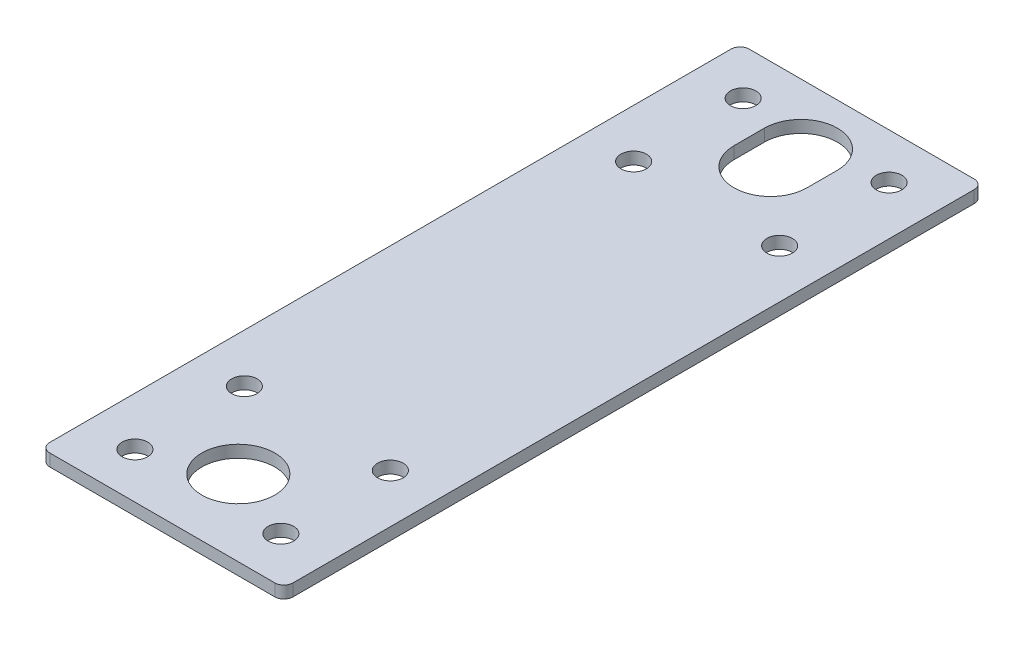
ISO-10303-21;
HEADER;
FILE_DESCRIPTION(('STEP AP214'),'2;1');
FILE_NAME('part.step','',(''),(''),'','','');
FILE_SCHEMA(('AUTOMOTIVE_DESIGN { 1 0 10303 214 1 1 1 1 }'));
ENDSEC;
DATA;
#1=APPLICATION_CONTEXT('core data for automotive mechanical design processes');
#2=APPLICATION_PROTOCOL_DEFINITION('international standard','automotive_design',2000,#1);
#3=PRODUCT_CONTEXT('',#1,'mechanical');
#4=PRODUCT('Part','Part','',(#3));
#5=PRODUCT_RELATED_PRODUCT_CATEGORY('part','',(#4));
#6=PRODUCT_DEFINITION_FORMATION('','',#4);
#7=PRODUCT_DEFINITION_CONTEXT('part definition',#1,'design');
#8=PRODUCT_DEFINITION('design','',#6,#7);
#9=PRODUCT_DEFINITION_SHAPE('','',#8);
#10=(LENGTH_UNIT() NAMED_UNIT(*) SI_UNIT(.MILLI.,.METRE.));
#11=(NAMED_UNIT(*) PLANE_ANGLE_UNIT() SI_UNIT($,.RADIAN.));
#12=(NAMED_UNIT(*) SI_UNIT($,.STERADIAN.) SOLID_ANGLE_UNIT());
#13=UNCERTAINTY_MEASURE_WITH_UNIT(LENGTH_MEASURE(1.E-05),#10,'distance_accuracy_value','');
#14=(GEOMETRIC_REPRESENTATION_CONTEXT(3) GLOBAL_UNCERTAINTY_ASSIGNED_CONTEXT((#13)) GLOBAL_UNIT_ASSIGNED_CONTEXT((#10,
#11,#12)) REPRESENTATION_CONTEXT('',''));
#15=CARTESIAN_POINT('',(0.,0.,0.));
#16=DIRECTION('',(0.,0.,1.));
#17=DIRECTION('',(1.,0.,0.));
#18=AXIS2_PLACEMENT_3D('',#15,#16,#17);
#19=CARTESIAN_POINT('',(-20.,2.,0.));
#20=DIRECTION('',(1.,0.,0.));
#21=DIRECTION('',(0.,0.,-1.));
#22=AXIS2_PLACEMENT_3D('',#19,#20,#21);
#23=PLANE('',#22);
#24=DIRECTION('',(0.,0.,1.));
#25=VECTOR('',#24,1.);
#26=CARTESIAN_POINT('',(-20.,2.,0.));
#27=LINE('',#26,#25);
#28=CARTESIAN_POINT('',(-20.,2.,-56.));
#29=VERTEX_POINT('',#28);
#30=CARTESIAN_POINT('',(-20.,2.,56.));
#31=VERTEX_POINT('',#30);
#32=EDGE_CURVE('E218',#29,#31,#27,.T.);
#33=ORIENTED_EDGE('',*,*,#32,.T.);
#34=DIRECTION('',(0.,-1.,0.));
#35=VECTOR('',#34,1.);
#36=CARTESIAN_POINT('',(-20.,0.,56.));
#37=LINE('',#36,#35);
#38=CARTESIAN_POINT('',(-20.,0.,56.));
#39=VERTEX_POINT('',#38);
#40=EDGE_CURVE('E248',#31,#39,#37,.T.);
#41=ORIENTED_EDGE('',*,*,#40,.T.);
#42=DIRECTION('',(0.,0.,1.));
#43=VECTOR('',#42,1.);
#44=CARTESIAN_POINT('',(-20.,0.,0.));
#45=LINE('',#44,#43);
#46=CARTESIAN_POINT('',(-20.,0.,-56.));
#47=VERTEX_POINT('',#46);
#48=EDGE_CURVE('E215',#47,#39,#45,.T.);
#49=ORIENTED_EDGE('',*,*,#48,.F.);
#50=DIRECTION('',(0.,-1.,0.));
#51=VECTOR('',#50,1.);
#52=CARTESIAN_POINT('',(-20.,2.,-56.));
#53=LINE('',#52,#51);
#54=EDGE_CURVE('E246',#47,#29,#53,.F.);
#55=ORIENTED_EDGE('',*,*,#54,.T.);
#56=EDGE_LOOP('',(#33,#41,#49,#55));
#57=FACE_BOUND('',#56,.T.);
#58=ADVANCED_FACE('F35',(#57),#23,.T.);
#59=CARTESIAN_POINT('',(0.,2.,-57.5));
#60=DIRECTION('',(0.,0.,-1.));
#61=DIRECTION('',(-1.,0.,0.));
#62=AXIS2_PLACEMENT_3D('',#59,#60,#61);
#63=PLANE('',#62);
#64=DIRECTION('',(1.,0.,0.));
#65=VECTOR('',#64,1.);
#66=CARTESIAN_POINT('',(0.,2.,-57.5));
#67=LINE('',#66,#65);
#68=CARTESIAN_POINT('',(-58.5,2.,-57.5));
#69=VERTEX_POINT('',#68);
#70=CARTESIAN_POINT('',(-21.5,2.,-57.5));
#71=VERTEX_POINT('',#70);
#72=EDGE_CURVE('E221',#69,#71,#67,.T.);
#73=ORIENTED_EDGE('',*,*,#72,.T.);
#74=DIRECTION('',(0.,-1.,0.));
#75=VECTOR('',#74,1.);
#76=CARTESIAN_POINT('',(-21.5,2.,-57.5));
#77=LINE('',#76,#75);
#78=CARTESIAN_POINT('',(-21.5,0.,-57.5));
#79=VERTEX_POINT('',#78);
#80=EDGE_CURVE('E11',#71,#79,#77,.T.);
#81=ORIENTED_EDGE('',*,*,#80,.T.);
#82=DIRECTION('',(1.,0.,0.));
#83=VECTOR('',#82,1.);
#84=CARTESIAN_POINT('',(0.,0.,-57.5));
#85=LINE('',#84,#83);
#86=CARTESIAN_POINT('',(-58.5,0.,-57.5));
#87=VERTEX_POINT('',#86);
#88=EDGE_CURVE('E234',#87,#79,#85,.T.);
#89=ORIENTED_EDGE('',*,*,#88,.F.);
#90=DIRECTION('',(0.,-1.,0.));
#91=VECTOR('',#90,1.);
#92=CARTESIAN_POINT('',(-58.5,2.,-57.5));
#93=LINE('',#92,#91);
#94=EDGE_CURVE('E43',#87,#69,#93,.F.);
#95=ORIENTED_EDGE('',*,*,#94,.T.);
#96=EDGE_LOOP('',(#73,#81,#89,#95));
#97=FACE_BOUND('',#96,.T.);
#98=ADVANCED_FACE('F277',(#97),#63,.T.);
#99=CARTESIAN_POINT('',(-60.,2.,0.));
#100=DIRECTION('',(-1.,0.,0.));
#101=DIRECTION('',(0.,0.,1.));
#102=AXIS2_PLACEMENT_3D('',#99,#100,#101);
#103=PLANE('',#102);
#104=DIRECTION('',(0.,0.,-1.));
#105=VECTOR('',#104,1.);
#106=CARTESIAN_POINT('',(-60.,0.,0.));
#107=LINE('',#106,#105);
#108=CARTESIAN_POINT('',(-60.,0.,56.));
#109=VERTEX_POINT('',#108);
#110=CARTESIAN_POINT('',(-60.,0.,-56.));
#111=VERTEX_POINT('',#110);
#112=EDGE_CURVE('E237',#109,#111,#107,.T.);
#113=ORIENTED_EDGE('',*,*,#112,.F.);
#114=DIRECTION('',(0.,-1.,0.));
#115=VECTOR('',#114,1.);
#116=CARTESIAN_POINT('',(-60.,2.,56.));
#117=LINE('',#116,#115);
#118=CARTESIAN_POINT('',(-60.,2.,56.));
#119=VERTEX_POINT('',#118);
#120=EDGE_CURVE('E57',#109,#119,#117,.F.);
#121=ORIENTED_EDGE('',*,*,#120,.T.);
#122=DIRECTION('',(0.,0.,-1.));
#123=VECTOR('',#122,1.);
#124=CARTESIAN_POINT('',(-60.,2.,0.));
#125=LINE('',#124,#123);
#126=CARTESIAN_POINT('',(-60.,2.,-56.));
#127=VERTEX_POINT('',#126);
#128=EDGE_CURVE('E225',#119,#127,#125,.T.);
#129=ORIENTED_EDGE('',*,*,#128,.T.);
#130=DIRECTION('',(0.,-1.,0.));
#131=VECTOR('',#130,1.);
#132=CARTESIAN_POINT('',(-60.,2.,-56.));
#133=LINE('',#132,#131);
#134=EDGE_CURVE('E271',#127,#111,#133,.T.);
#135=ORIENTED_EDGE('',*,*,#134,.T.);
#136=EDGE_LOOP('',(#113,#121,#129,#135));
#137=FACE_BOUND('',#136,.T.);
#138=ADVANCED_FACE('F285',(#137),#103,.T.);
#139=CARTESIAN_POINT('',(0.,2.,57.5));
#140=DIRECTION('',(0.,0.,-1.));
#141=DIRECTION('',(-1.,0.,0.));
#142=AXIS2_PLACEMENT_3D('',#139,#140,#141);
#143=PLANE('',#142);
#144=DIRECTION('',(1.,0.,0.));
#145=VECTOR('',#144,1.);
#146=CARTESIAN_POINT('',(0.,0.,57.5));
#147=LINE('',#146,#145);
#148=CARTESIAN_POINT('',(-58.5,0.,57.5));
#149=VERTEX_POINT('',#148);
#150=CARTESIAN_POINT('',(-21.5,0.,57.5));
#151=VERTEX_POINT('',#150);
#152=EDGE_CURVE('E240',#149,#151,#147,.T.);
#153=ORIENTED_EDGE('',*,*,#152,.T.);
#154=DIRECTION('',(0.,-1.,0.));
#155=VECTOR('',#154,1.);
#156=CARTESIAN_POINT('',(-21.5,2.,57.5));
#157=LINE('',#156,#155);
#158=CARTESIAN_POINT('',(-21.5,2.,57.5));
#159=VERTEX_POINT('',#158);
#160=EDGE_CURVE('E262',#151,#159,#157,.F.);
#161=ORIENTED_EDGE('',*,*,#160,.T.);
#162=DIRECTION('',(1.,0.,0.));
#163=VECTOR('',#162,1.);
#164=CARTESIAN_POINT('',(0.,2.,57.5));
#165=LINE('',#164,#163);
#166=CARTESIAN_POINT('',(-58.5,2.,57.5));
#167=VERTEX_POINT('',#166);
#168=EDGE_CURVE('E227',#167,#159,#165,.T.);
#169=ORIENTED_EDGE('',*,*,#168,.F.);
#170=DIRECTION('',(0.,-1.,0.));
#171=VECTOR('',#170,1.);
#172=CARTESIAN_POINT('',(-58.5,0.,57.5));
#173=LINE('',#172,#171);
#174=EDGE_CURVE('E259',#167,#149,#173,.T.);
#175=ORIENTED_EDGE('',*,*,#174,.T.);
#176=EDGE_LOOP('',(#153,#161,#169,#175));
#177=FACE_BOUND('',#176,.T.);
#178=ADVANCED_FACE('F294',(#177),#143,.F.);
#179=CARTESIAN_POINT('',(-40.,2.,45.));
#180=DIRECTION('',(0.,-1.,0.));
#181=DIRECTION('',(0.,0.,-1.));
#182=AXIS2_PLACEMENT_3D('',#179,#180,#181);
#183=CYLINDRICAL_SURFACE('',#182,5.99999999999999);
#184=CARTESIAN_POINT('',(-40.,2.,45.));
#185=DIRECTION('',(0.,1.,0.));
#186=DIRECTION('',(0.,0.,1.));
#187=AXIS2_PLACEMENT_3D('',#184,#185,#186);
#188=CIRCLE('',#187,5.99999999999999);
#189=CARTESIAN_POINT('',(-40.,2.,51.));
#190=VERTEX_POINT('',#189);
#191=EDGE_CURVE('E137',#190,#190,#188,.F.);
#192=ORIENTED_EDGE('',*,*,#191,.F.);
#193=EDGE_LOOP('',(#192));
#194=FACE_BOUND('',#193,.T.);
#195=CARTESIAN_POINT('',(-40.,0.,45.));
#196=DIRECTION('',(0.,1.,0.));
#197=DIRECTION('',(0.,0.,1.));
#198=AXIS2_PLACEMENT_3D('',#195,#196,#197);
#199=CIRCLE('',#198,5.99999999999999);
#200=CARTESIAN_POINT('',(-40.,0.,51.));
#201=VERTEX_POINT('',#200);
#202=EDGE_CURVE('E222',#201,#201,#199,.F.);
#203=ORIENTED_EDGE('',*,*,#202,.T.);
#204=EDGE_LOOP('',(#203));
#205=FACE_BOUND('',#204,.T.);
#206=ADVANCED_FACE('F369',(#194,#205),#183,.F.);
#207=CARTESIAN_POINT('',(0.,2.,0.));
#208=DIRECTION('',(0.,1.,0.));
#209=DIRECTION('',(0.,0.,1.));
#210=AXIS2_PLACEMENT_3D('',#207,#208,#209);
#211=PLANE('',#210);
#212=DIRECTION('',(0.,0.,-1.));
#213=VECTOR('',#212,1.);
#214=CARTESIAN_POINT('',(-34.,2.,-47.5));
#215=LINE('',#214,#213);
#216=CARTESIAN_POINT('',(-34.,2.,-42.5));
#217=VERTEX_POINT('',#216);
#218=CARTESIAN_POINT('',(-34.,2.,-47.5));
#219=VERTEX_POINT('',#218);
#220=EDGE_CURVE('E152',#217,#219,#215,.T.);
#221=ORIENTED_EDGE('',*,*,#220,.F.);
#222=CARTESIAN_POINT('',(-40.,2.,-42.5));
#223=DIRECTION('',(0.,1.,0.));
#224=DIRECTION('',(0.,0.,1.));
#225=AXIS2_PLACEMENT_3D('',#222,#223,#224);
#226=CIRCLE('',#225,6.);
#227=CARTESIAN_POINT('',(-46.,2.,-42.5));
#228=VERTEX_POINT('',#227);
#229=EDGE_CURVE('E155',#228,#217,#226,.T.);
#230=ORIENTED_EDGE('',*,*,#229,.F.);
#231=DIRECTION('',(0.,0.,1.));
#232=VECTOR('',#231,1.);
#233=CARTESIAN_POINT('',(-46.,2.,-47.5));
#234=LINE('',#233,#232);
#235=CARTESIAN_POINT('',(-46.,2.,-47.5));
#236=VERTEX_POINT('',#235);
#237=EDGE_CURVE('E159',#236,#228,#234,.T.);
#238=ORIENTED_EDGE('',*,*,#237,.F.);
#239=CARTESIAN_POINT('',(-40.,2.,-47.5));
#240=DIRECTION('',(0.,1.,0.));
#241=DIRECTION('',(0.,0.,1.));
#242=AXIS2_PLACEMENT_3D('',#239,#240,#241);
#243=CIRCLE('',#242,6.);
#244=EDGE_CURVE('E146',#219,#236,#243,.T.);
#245=ORIENTED_EDGE('',*,*,#244,.F.);
#246=EDGE_LOOP('',(#221,#230,#238,#245));
#247=FACE_BOUND('',#246,.T.);
#248=CARTESIAN_POINT('',(-28.,2.,32.));
#249=DIRECTION('',(0.,1.,0.));
#250=DIRECTION('',(0.,0.,-1.));
#251=AXIS2_PLACEMENT_3D('',#248,#249,#250);
#252=CIRCLE('',#251,2.1);
#253=CARTESIAN_POINT('',(-28.,2.,29.9));
#254=VERTEX_POINT('',#253);
#255=EDGE_CURVE('E174',#254,#254,#252,.T.);
#256=ORIENTED_EDGE('',*,*,#255,.F.);
#257=EDGE_LOOP('',(#256));
#258=FACE_BOUND('',#257,.T.);
#259=CARTESIAN_POINT('',(-28.,2.,50.));
#260=DIRECTION('',(0.,1.,0.));
#261=DIRECTION('',(0.,0.,1.));
#262=AXIS2_PLACEMENT_3D('',#259,#260,#261);
#263=CIRCLE('',#262,2.1);
#264=CARTESIAN_POINT('',(-28.,2.,52.1));
#265=VERTEX_POINT('',#264);
#266=EDGE_CURVE('E180',#265,#265,#263,.T.);
#267=ORIENTED_EDGE('',*,*,#266,.F.);
#268=EDGE_LOOP('',(#267));
#269=FACE_BOUND('',#268,.T.);
#270=CARTESIAN_POINT('',(-52.,2.,50.));
#271=DIRECTION('',(0.,1.,0.));
#272=DIRECTION('',(0.,0.,-1.));
#273=AXIS2_PLACEMENT_3D('',#270,#271,#272);
#274=CIRCLE('',#273,2.1);
#275=CARTESIAN_POINT('',(-52.,2.,47.9));
#276=VERTEX_POINT('',#275);
#277=EDGE_CURVE('E186',#276,#276,#274,.T.);
#278=ORIENTED_EDGE('',*,*,#277,.F.);
#279=EDGE_LOOP('',(#278));
#280=FACE_BOUND('',#279,.T.);
#281=CARTESIAN_POINT('',(-28.,2.,-50.));
#282=DIRECTION('',(0.,1.,0.));
#283=DIRECTION('',(0.,0.,-1.));
#284=AXIS2_PLACEMENT_3D('',#281,#282,#283);
#285=CIRCLE('',#284,2.1);
#286=CARTESIAN_POINT('',(-28.,2.,-52.1));
#287=VERTEX_POINT('',#286);
#288=EDGE_CURVE('E192',#287,#287,#285,.T.);
#289=ORIENTED_EDGE('',*,*,#288,.F.);
#290=EDGE_LOOP('',(#289));
#291=FACE_BOUND('',#290,.T.);
#292=CARTESIAN_POINT('',(-52.,2.,-50.));
#293=DIRECTION('',(0.,1.,0.));
#294=DIRECTION('',(0.,0.,1.));
#295=AXIS2_PLACEMENT_3D('',#292,#293,#294);
#296=CIRCLE('',#295,2.1);
#297=CARTESIAN_POINT('',(-52.,2.,-47.9));
#298=VERTEX_POINT('',#297);
#299=EDGE_CURVE('E198',#298,#298,#296,.T.);
#300=ORIENTED_EDGE('',*,*,#299,.F.);
#301=EDGE_LOOP('',(#300));
#302=FACE_BOUND('',#301,.T.);
#303=CARTESIAN_POINT('',(-52.,2.,-32.));
#304=DIRECTION('',(0.,1.,0.));
#305=DIRECTION('',(0.,0.,-1.));
#306=AXIS2_PLACEMENT_3D('',#303,#304,#305);
#307=CIRCLE('',#306,2.1);
#308=CARTESIAN_POINT('',(-52.,2.,-34.1));
#309=VERTEX_POINT('',#308);
#310=EDGE_CURVE('E204',#309,#309,#307,.T.);
#311=ORIENTED_EDGE('',*,*,#310,.F.);
#312=EDGE_LOOP('',(#311));
#313=FACE_BOUND('',#312,.T.);
#314=CARTESIAN_POINT('',(-28.,2.,-32.));
#315=DIRECTION('',(0.,1.,0.));
#316=DIRECTION('',(0.,0.,1.));
#317=AXIS2_PLACEMENT_3D('',#314,#315,#316);
#318=CIRCLE('',#317,2.1);
#319=CARTESIAN_POINT('',(-28.,2.,-29.9));
#320=VERTEX_POINT('',#319);
#321=EDGE_CURVE('E165',#320,#320,#318,.T.);
#322=ORIENTED_EDGE('',*,*,#321,.F.);
#323=EDGE_LOOP('',(#322));
#324=FACE_BOUND('',#323,.T.);
#325=CARTESIAN_POINT('',(-52.,2.,32.));
#326=DIRECTION('',(0.,1.,0.));
#327=DIRECTION('',(0.,0.,1.));
#328=AXIS2_PLACEMENT_3D('',#325,#326,#327);
#329=CIRCLE('',#328,2.1);
#330=CARTESIAN_POINT('',(-52.,2.,34.1));
#331=VERTEX_POINT('',#330);
#332=EDGE_CURVE('E173',#331,#331,#329,.T.);
#333=ORIENTED_EDGE('',*,*,#332,.F.);
#334=EDGE_LOOP('',(#333));
#335=FACE_BOUND('',#334,.T.);
#336=ORIENTED_EDGE('',*,*,#168,.T.);
#337=CARTESIAN_POINT('',(-21.5,2.,56.));
#338=DIRECTION('',(0.,1.,0.));
#339=DIRECTION('',(0.,0.,1.));
#340=AXIS2_PLACEMENT_3D('',#337,#338,#339);
#341=CIRCLE('',#340,1.5);
#342=EDGE_CURVE('E269',#159,#31,#341,.T.);
#343=ORIENTED_EDGE('',*,*,#342,.T.);
#344=ORIENTED_EDGE('',*,*,#32,.F.);
#345=CARTESIAN_POINT('',(-21.5,2.,-56.));
#346=DIRECTION('',(0.,1.,0.));
#347=DIRECTION('',(0.,0.,1.));
#348=AXIS2_PLACEMENT_3D('',#345,#346,#347);
#349=CIRCLE('',#348,1.5);
#350=EDGE_CURVE('E265',#29,#71,#349,.T.);
#351=ORIENTED_EDGE('',*,*,#350,.T.);
#352=ORIENTED_EDGE('',*,*,#72,.F.);
#353=CARTESIAN_POINT('',(-58.5,2.,-56.));
#354=DIRECTION('',(0.,1.,0.));
#355=DIRECTION('',(0.,0.,1.));
#356=AXIS2_PLACEMENT_3D('',#353,#354,#355);
#357=CIRCLE('',#356,1.5);
#358=EDGE_CURVE('E50',#69,#127,#357,.T.);
#359=ORIENTED_EDGE('',*,*,#358,.T.);
#360=ORIENTED_EDGE('',*,*,#128,.F.);
#361=CARTESIAN_POINT('',(-58.5,2.,56.));
#362=DIRECTION('',(0.,1.,0.));
#363=DIRECTION('',(0.,0.,1.));
#364=AXIS2_PLACEMENT_3D('',#361,#362,#363);
#365=CIRCLE('',#364,1.5);
#366=EDGE_CURVE('E267',#119,#167,#365,.T.);
#367=ORIENTED_EDGE('',*,*,#366,.T.);
#368=EDGE_LOOP('',(#336,#343,#344,#351,#352,#359,#360,#367));
#369=FACE_BOUND('',#368,.T.);
#370=ORIENTED_EDGE('',*,*,#191,.T.);
#371=EDGE_LOOP('',(#370));
#372=FACE_BOUND('',#371,.T.);
#373=ADVANCED_FACE('F280',(#247,#258,#269,#280,#291,#302,#313,#324,#335,#369,#372),#211,.T.);
#374=CARTESIAN_POINT('',(0.,0.,0.));
#375=DIRECTION('',(0.,1.,0.));
#376=DIRECTION('',(0.,0.,1.));
#377=AXIS2_PLACEMENT_3D('',#374,#375,#376);
#378=PLANE('',#377);
#379=CARTESIAN_POINT('',(-28.,0.,32.));
#380=DIRECTION('',(0.,1.,0.));
#381=DIRECTION('',(0.,0.,-1.));
#382=AXIS2_PLACEMENT_3D('',#379,#380,#381);
#383=CIRCLE('',#382,2.1);
#384=CARTESIAN_POINT('',(-28.,0.,29.9));
#385=VERTEX_POINT('',#384);
#386=EDGE_CURVE('E170',#385,#385,#383,.T.);
#387=ORIENTED_EDGE('',*,*,#386,.T.);
#388=EDGE_LOOP('',(#387));
#389=FACE_BOUND('',#388,.T.);
#390=CARTESIAN_POINT('',(-28.,0.,50.));
#391=DIRECTION('',(0.,1.,0.));
#392=DIRECTION('',(0.,0.,1.));
#393=AXIS2_PLACEMENT_3D('',#390,#391,#392);
#394=CIRCLE('',#393,2.1);
#395=CARTESIAN_POINT('',(-28.,0.,52.1));
#396=VERTEX_POINT('',#395);
#397=EDGE_CURVE('E177',#396,#396,#394,.T.);
#398=ORIENTED_EDGE('',*,*,#397,.T.);
#399=EDGE_LOOP('',(#398));
#400=FACE_BOUND('',#399,.T.);
#401=CARTESIAN_POINT('',(-52.,0.,50.));
#402=DIRECTION('',(0.,1.,0.));
#403=DIRECTION('',(0.,0.,-1.));
#404=AXIS2_PLACEMENT_3D('',#401,#402,#403);
#405=CIRCLE('',#404,2.1);
#406=CARTESIAN_POINT('',(-52.,0.,47.9));
#407=VERTEX_POINT('',#406);
#408=EDGE_CURVE('E183',#407,#407,#405,.T.);
#409=ORIENTED_EDGE('',*,*,#408,.T.);
#410=EDGE_LOOP('',(#409));
#411=FACE_BOUND('',#410,.T.);
#412=CARTESIAN_POINT('',(-28.,0.,-50.));
#413=DIRECTION('',(0.,1.,0.));
#414=DIRECTION('',(0.,0.,-1.));
#415=AXIS2_PLACEMENT_3D('',#412,#413,#414);
#416=CIRCLE('',#415,2.1);
#417=CARTESIAN_POINT('',(-28.,0.,-52.1));
#418=VERTEX_POINT('',#417);
#419=EDGE_CURVE('E189',#418,#418,#416,.T.);
#420=ORIENTED_EDGE('',*,*,#419,.T.);
#421=EDGE_LOOP('',(#420));
#422=FACE_BOUND('',#421,.T.);
#423=CARTESIAN_POINT('',(-52.,0.,-50.));
#424=DIRECTION('',(0.,1.,0.));
#425=DIRECTION('',(0.,0.,1.));
#426=AXIS2_PLACEMENT_3D('',#423,#424,#425);
#427=CIRCLE('',#426,2.1);
#428=CARTESIAN_POINT('',(-52.,0.,-47.9));
#429=VERTEX_POINT('',#428);
#430=EDGE_CURVE('E195',#429,#429,#427,.T.);
#431=ORIENTED_EDGE('',*,*,#430,.T.);
#432=EDGE_LOOP('',(#431));
#433=FACE_BOUND('',#432,.T.);
#434=CARTESIAN_POINT('',(-52.,0.,-32.));
#435=DIRECTION('',(0.,1.,0.));
#436=DIRECTION('',(0.,0.,-1.));
#437=AXIS2_PLACEMENT_3D('',#434,#435,#436);
#438=CIRCLE('',#437,2.1);
#439=CARTESIAN_POINT('',(-52.,0.,-34.1));
#440=VERTEX_POINT('',#439);
#441=EDGE_CURVE('E201',#440,#440,#438,.T.);
#442=ORIENTED_EDGE('',*,*,#441,.T.);
#443=EDGE_LOOP('',(#442));
#444=FACE_BOUND('',#443,.T.);
#445=CARTESIAN_POINT('',(-28.,0.,-32.));
#446=DIRECTION('',(0.,1.,0.));
#447=DIRECTION('',(0.,0.,1.));
#448=AXIS2_PLACEMENT_3D('',#445,#446,#447);
#449=CIRCLE('',#448,2.1);
#450=CARTESIAN_POINT('',(-28.,0.,-29.9));
#451=VERTEX_POINT('',#450);
#452=EDGE_CURVE('E207',#451,#451,#449,.T.);
#453=ORIENTED_EDGE('',*,*,#452,.T.);
#454=EDGE_LOOP('',(#453));
#455=FACE_BOUND('',#454,.T.);
#456=CARTESIAN_POINT('',(-52.,0.,32.));
#457=DIRECTION('',(0.,1.,0.));
#458=DIRECTION('',(0.,0.,1.));
#459=AXIS2_PLACEMENT_3D('',#456,#457,#458);
#460=CIRCLE('',#459,2.1);
#461=CARTESIAN_POINT('',(-52.,0.,34.1));
#462=VERTEX_POINT('',#461);
#463=EDGE_CURVE('E212',#462,#462,#460,.T.);
#464=ORIENTED_EDGE('',*,*,#463,.T.);
#465=EDGE_LOOP('',(#464));
#466=FACE_BOUND('',#465,.T.);
#467=ORIENTED_EDGE('',*,*,#48,.T.);
#468=CARTESIAN_POINT('',(-21.5,0.,56.));
#469=DIRECTION('',(0.,1.,0.));
#470=DIRECTION('',(0.,0.,1.));
#471=AXIS2_PLACEMENT_3D('',#468,#469,#470);
#472=CIRCLE('',#471,1.5);
#473=EDGE_CURVE('E257',#39,#151,#472,.F.);
#474=ORIENTED_EDGE('',*,*,#473,.T.);
#475=ORIENTED_EDGE('',*,*,#152,.F.);
#476=CARTESIAN_POINT('',(-58.5,0.,56.));
#477=DIRECTION('',(0.,1.,0.));
#478=DIRECTION('',(0.,0.,1.));
#479=AXIS2_PLACEMENT_3D('',#476,#477,#478);
#480=CIRCLE('',#479,1.5);
#481=EDGE_CURVE('E255',#149,#109,#480,.F.);
#482=ORIENTED_EDGE('',*,*,#481,.T.);
#483=ORIENTED_EDGE('',*,*,#112,.T.);
#484=CARTESIAN_POINT('',(-58.5,0.,-56.));
#485=DIRECTION('',(0.,1.,0.));
#486=DIRECTION('',(0.,0.,1.));
#487=AXIS2_PLACEMENT_3D('',#484,#485,#486);
#488=CIRCLE('',#487,1.5);
#489=EDGE_CURVE('E251',#111,#87,#488,.F.);
#490=ORIENTED_EDGE('',*,*,#489,.T.);
#491=ORIENTED_EDGE('',*,*,#88,.T.);
#492=CARTESIAN_POINT('',(-21.5,0.,-56.));
#493=DIRECTION('',(0.,1.,0.));
#494=DIRECTION('',(0.,0.,1.));
#495=AXIS2_PLACEMENT_3D('',#492,#493,#494);
#496=CIRCLE('',#495,1.5);
#497=EDGE_CURVE('E253',#79,#47,#496,.F.);
#498=ORIENTED_EDGE('',*,*,#497,.T.);
#499=EDGE_LOOP('',(#467,#474,#475,#482,#483,#490,#491,#498));
#500=FACE_BOUND('',#499,.T.);
#501=CARTESIAN_POINT('',(-40.,0.,-42.5));
#502=DIRECTION('',(0.,1.,0.));
#503=DIRECTION('',(0.,0.,1.));
#504=AXIS2_PLACEMENT_3D('',#501,#502,#503);
#505=CIRCLE('',#504,6.);
#506=CARTESIAN_POINT('',(-46.,0.,-42.5));
#507=VERTEX_POINT('',#506);
#508=CARTESIAN_POINT('',(-34.,0.,-42.5));
#509=VERTEX_POINT('',#508);
#510=EDGE_CURVE('E148',#507,#509,#505,.T.);
#511=ORIENTED_EDGE('',*,*,#510,.T.);
#512=DIRECTION('',(0.,0.,-1.));
#513=VECTOR('',#512,1.);
#514=CARTESIAN_POINT('',(-34.,0.,0.));
#515=LINE('',#514,#513);
#516=CARTESIAN_POINT('',(-34.,0.,-47.5));
#517=VERTEX_POINT('',#516);
#518=EDGE_CURVE('E136',#509,#517,#515,.T.);
#519=ORIENTED_EDGE('',*,*,#518,.T.);
#520=CARTESIAN_POINT('',(-40.,0.,-47.5));
#521=DIRECTION('',(0.,1.,0.));
#522=DIRECTION('',(0.,0.,1.));
#523=AXIS2_PLACEMENT_3D('',#520,#521,#522);
#524=CIRCLE('',#523,6.);
#525=CARTESIAN_POINT('',(-46.,0.,-47.5));
#526=VERTEX_POINT('',#525);
#527=EDGE_CURVE('E143',#517,#526,#524,.T.);
#528=ORIENTED_EDGE('',*,*,#527,.T.);
#529=DIRECTION('',(0.,0.,1.));
#530=VECTOR('',#529,1.);
#531=CARTESIAN_POINT('',(-46.,0.,0.));
#532=LINE('',#531,#530);
#533=EDGE_CURVE('E126',#526,#507,#532,.T.);
#534=ORIENTED_EDGE('',*,*,#533,.T.);
#535=EDGE_LOOP('',(#511,#519,#528,#534));
#536=FACE_BOUND('',#535,.T.);
#537=ORIENTED_EDGE('',*,*,#202,.F.);
#538=EDGE_LOOP('',(#537));
#539=FACE_BOUND('',#538,.T.);
#540=ADVANCED_FACE('F150',(#389,#400,#411,#422,#433,#444,#455,#466,#500,#536,#539),#378,.F.);
#541=CARTESIAN_POINT('',(-52.,0.,32.));
#542=DIRECTION('',(0.,1.,0.));
#543=DIRECTION('',(0.,0.,1.));
#544=AXIS2_PLACEMENT_3D('',#541,#542,#543);
#545=CYLINDRICAL_SURFACE('',#544,2.1);
#546=ORIENTED_EDGE('',*,*,#463,.F.);
#547=EDGE_LOOP('',(#546));
#548=FACE_BOUND('',#547,.T.);
#549=ORIENTED_EDGE('',*,*,#332,.T.);
#550=EDGE_LOOP('',(#549));
#551=FACE_BOUND('',#550,.T.);
#552=ADVANCED_FACE('F362',(#548,#551),#545,.F.);
#553=CARTESIAN_POINT('',(-28.,0.,-32.));
#554=DIRECTION('',(0.,1.,0.));
#555=DIRECTION('',(0.,0.,1.));
#556=AXIS2_PLACEMENT_3D('',#553,#554,#555);
#557=CYLINDRICAL_SURFACE('',#556,2.1);
#558=ORIENTED_EDGE('',*,*,#452,.F.);
#559=EDGE_LOOP('',(#558));
#560=FACE_BOUND('',#559,.T.);
#561=ORIENTED_EDGE('',*,*,#321,.T.);
#562=EDGE_LOOP('',(#561));
#563=FACE_BOUND('',#562,.T.);
#564=ADVANCED_FACE('F358',(#560,#563),#557,.F.);
#565=CARTESIAN_POINT('',(-52.,0.,-32.));
#566=DIRECTION('',(0.,1.,0.));
#567=DIRECTION('',(0.,0.,1.));
#568=AXIS2_PLACEMENT_3D('',#565,#566,#567);
#569=CYLINDRICAL_SURFACE('',#568,2.1);
#570=ORIENTED_EDGE('',*,*,#441,.F.);
#571=EDGE_LOOP('',(#570));
#572=FACE_BOUND('',#571,.T.);
#573=ORIENTED_EDGE('',*,*,#310,.T.);
#574=EDGE_LOOP('',(#573));
#575=FACE_BOUND('',#574,.T.);
#576=ADVANCED_FACE('F354',(#572,#575),#569,.F.);
#577=CARTESIAN_POINT('',(-52.,0.,-50.));
#578=DIRECTION('',(0.,1.,0.));
#579=DIRECTION('',(0.,0.,1.));
#580=AXIS2_PLACEMENT_3D('',#577,#578,#579);
#581=CYLINDRICAL_SURFACE('',#580,2.1);
#582=ORIENTED_EDGE('',*,*,#430,.F.);
#583=EDGE_LOOP('',(#582));
#584=FACE_BOUND('',#583,.T.);
#585=ORIENTED_EDGE('',*,*,#299,.T.);
#586=EDGE_LOOP('',(#585));
#587=FACE_BOUND('',#586,.T.);
#588=ADVANCED_FACE('F350',(#584,#587),#581,.F.);
#589=CARTESIAN_POINT('',(-28.,0.,-50.));
#590=DIRECTION('',(0.,1.,0.));
#591=DIRECTION('',(0.,0.,1.));
#592=AXIS2_PLACEMENT_3D('',#589,#590,#591);
#593=CYLINDRICAL_SURFACE('',#592,2.1);
#594=ORIENTED_EDGE('',*,*,#419,.F.);
#595=EDGE_LOOP('',(#594));
#596=FACE_BOUND('',#595,.T.);
#597=ORIENTED_EDGE('',*,*,#288,.T.);
#598=EDGE_LOOP('',(#597));
#599=FACE_BOUND('',#598,.T.);
#600=ADVANCED_FACE('F346',(#596,#599),#593,.F.);
#601=CARTESIAN_POINT('',(-52.,0.,50.));
#602=DIRECTION('',(0.,1.,0.));
#603=DIRECTION('',(0.,0.,1.));
#604=AXIS2_PLACEMENT_3D('',#601,#602,#603);
#605=CYLINDRICAL_SURFACE('',#604,2.1);
#606=ORIENTED_EDGE('',*,*,#408,.F.);
#607=EDGE_LOOP('',(#606));
#608=FACE_BOUND('',#607,.T.);
#609=ORIENTED_EDGE('',*,*,#277,.T.);
#610=EDGE_LOOP('',(#609));
#611=FACE_BOUND('',#610,.T.);
#612=ADVANCED_FACE('F342',(#608,#611),#605,.F.);
#613=CARTESIAN_POINT('',(-28.,0.,50.));
#614=DIRECTION('',(0.,1.,0.));
#615=DIRECTION('',(0.,0.,1.));
#616=AXIS2_PLACEMENT_3D('',#613,#614,#615);
#617=CYLINDRICAL_SURFACE('',#616,2.1);
#618=ORIENTED_EDGE('',*,*,#397,.F.);
#619=EDGE_LOOP('',(#618));
#620=FACE_BOUND('',#619,.T.);
#621=ORIENTED_EDGE('',*,*,#266,.T.);
#622=EDGE_LOOP('',(#621));
#623=FACE_BOUND('',#622,.T.);
#624=ADVANCED_FACE('F338',(#620,#623),#617,.F.);
#625=CARTESIAN_POINT('',(-28.,0.,32.));
#626=DIRECTION('',(0.,1.,0.));
#627=DIRECTION('',(0.,0.,1.));
#628=AXIS2_PLACEMENT_3D('',#625,#626,#627);
#629=CYLINDRICAL_SURFACE('',#628,2.1);
#630=ORIENTED_EDGE('',*,*,#386,.F.);
#631=EDGE_LOOP('',(#630));
#632=FACE_BOUND('',#631,.T.);
#633=ORIENTED_EDGE('',*,*,#255,.T.);
#634=EDGE_LOOP('',(#633));
#635=FACE_BOUND('',#634,.T.);
#636=ADVANCED_FACE('F335',(#632,#635),#629,.F.);
#637=CARTESIAN_POINT('',(-34.,0.,-47.5));
#638=DIRECTION('',(1.,0.,0.));
#639=DIRECTION('',(0.,0.,-1.));
#640=AXIS2_PLACEMENT_3D('',#637,#638,#639);
#641=PLANE('',#640);
#642=ORIENTED_EDGE('',*,*,#220,.T.);
#643=DIRECTION('',(0.,1.,0.));
#644=VECTOR('',#643,1.);
#645=CARTESIAN_POINT('',(-34.,0.,-47.5));
#646=LINE('',#645,#644);
#647=EDGE_CURVE('E163',#517,#219,#646,.T.);
#648=ORIENTED_EDGE('',*,*,#647,.F.);
#649=ORIENTED_EDGE('',*,*,#518,.F.);
#650=DIRECTION('',(0.,1.,0.));
#651=VECTOR('',#650,1.);
#652=CARTESIAN_POINT('',(-34.,0.,-42.5));
#653=LINE('',#652,#651);
#654=EDGE_CURVE('E166',#509,#217,#653,.T.);
#655=ORIENTED_EDGE('',*,*,#654,.T.);
#656=EDGE_LOOP('',(#642,#648,#649,#655));
#657=FACE_BOUND('',#656,.T.);
#658=ADVANCED_FACE('F332',(#657),#641,.F.);
#659=CARTESIAN_POINT('',(-46.,0.,-47.5));
#660=DIRECTION('',(-1.,0.,0.));
#661=DIRECTION('',(0.,0.,1.));
#662=AXIS2_PLACEMENT_3D('',#659,#660,#661);
#663=PLANE('',#662);
#664=ORIENTED_EDGE('',*,*,#237,.T.);
#665=DIRECTION('',(0.,1.,0.));
#666=VECTOR('',#665,1.);
#667=CARTESIAN_POINT('',(-46.,0.,-42.5));
#668=LINE('',#667,#666);
#669=EDGE_CURVE('E132',#507,#228,#668,.T.);
#670=ORIENTED_EDGE('',*,*,#669,.F.);
#671=ORIENTED_EDGE('',*,*,#533,.F.);
#672=DIRECTION('',(0.,1.,0.));
#673=VECTOR('',#672,1.);
#674=CARTESIAN_POINT('',(-46.,0.,-47.5));
#675=LINE('',#674,#673);
#676=EDGE_CURVE('E129',#526,#236,#675,.T.);
#677=ORIENTED_EDGE('',*,*,#676,.T.);
#678=EDGE_LOOP('',(#664,#670,#671,#677));
#679=FACE_BOUND('',#678,.T.);
#680=ADVANCED_FACE('F128',(#679),#663,.F.);
#681=CARTESIAN_POINT('',(-40.,0.,-47.5));
#682=DIRECTION('',(0.,1.,0.));
#683=DIRECTION('',(0.,0.,1.));
#684=AXIS2_PLACEMENT_3D('',#681,#682,#683);
#685=CYLINDRICAL_SURFACE('',#684,6.);
#686=ORIENTED_EDGE('',*,*,#244,.T.);
#687=ORIENTED_EDGE('',*,*,#676,.F.);
#688=ORIENTED_EDGE('',*,*,#527,.F.);
#689=ORIENTED_EDGE('',*,*,#647,.T.);
#690=EDGE_LOOP('',(#686,#687,#688,#689));
#691=FACE_BOUND('',#690,.T.);
#692=ADVANCED_FACE('F141',(#691),#685,.F.);
#693=CARTESIAN_POINT('',(-40.,0.,-42.5));
#694=DIRECTION('',(0.,1.,0.));
#695=DIRECTION('',(0.,0.,1.));
#696=AXIS2_PLACEMENT_3D('',#693,#694,#695);
#697=CYLINDRICAL_SURFACE('',#696,6.);
#698=ORIENTED_EDGE('',*,*,#229,.T.);
#699=ORIENTED_EDGE('',*,*,#654,.F.);
#700=ORIENTED_EDGE('',*,*,#510,.F.);
#701=ORIENTED_EDGE('',*,*,#669,.T.);
#702=EDGE_LOOP('',(#698,#699,#700,#701));
#703=FACE_BOUND('',#702,.T.);
#704=ADVANCED_FACE('F321',(#703),#697,.F.);
#705=CARTESIAN_POINT('',(-21.5,2.,56.));
#706=DIRECTION('',(0.,1.,0.));
#707=DIRECTION('',(0.,0.,1.));
#708=AXIS2_PLACEMENT_3D('',#705,#706,#707);
#709=CYLINDRICAL_SURFACE('',#708,1.5);
#710=ORIENTED_EDGE('',*,*,#342,.F.);
#711=ORIENTED_EDGE('',*,*,#160,.F.);
#712=ORIENTED_EDGE('',*,*,#473,.F.);
#713=ORIENTED_EDGE('',*,*,#40,.F.);
#714=EDGE_LOOP('',(#710,#711,#712,#713));
#715=FACE_BOUND('',#714,.T.);
#716=ADVANCED_FACE('F299',(#715),#709,.T.);
#717=CARTESIAN_POINT('',(-58.5,2.,56.));
#718=DIRECTION('',(0.,1.,0.));
#719=DIRECTION('',(0.,0.,1.));
#720=AXIS2_PLACEMENT_3D('',#717,#718,#719);
#721=CYLINDRICAL_SURFACE('',#720,1.5);
#722=ORIENTED_EDGE('',*,*,#366,.F.);
#723=ORIENTED_EDGE('',*,*,#120,.F.);
#724=ORIENTED_EDGE('',*,*,#481,.F.);
#725=ORIENTED_EDGE('',*,*,#174,.F.);
#726=EDGE_LOOP('',(#722,#723,#724,#725));
#727=FACE_BOUND('',#726,.T.);
#728=ADVANCED_FACE('F291',(#727),#721,.T.);
#729=CARTESIAN_POINT('',(-21.5,2.,-56.));
#730=DIRECTION('',(0.,-1.,0.));
#731=DIRECTION('',(0.,0.,-1.));
#732=AXIS2_PLACEMENT_3D('',#729,#730,#731);
#733=CYLINDRICAL_SURFACE('',#732,1.5);
#734=ORIENTED_EDGE('',*,*,#350,.F.);
#735=ORIENTED_EDGE('',*,*,#54,.F.);
#736=ORIENTED_EDGE('',*,*,#497,.F.);
#737=ORIENTED_EDGE('',*,*,#80,.F.);
#738=EDGE_LOOP('',(#734,#735,#736,#737));
#739=FACE_BOUND('',#738,.T.);
#740=ADVANCED_FACE('F304',(#739),#733,.T.);
#741=CARTESIAN_POINT('',(-58.5,2.,-56.));
#742=DIRECTION('',(0.,-1.,0.));
#743=DIRECTION('',(0.,0.,-1.));
#744=AXIS2_PLACEMENT_3D('',#741,#742,#743);
#745=CYLINDRICAL_SURFACE('',#744,1.5);
#746=ORIENTED_EDGE('',*,*,#358,.F.);
#747=ORIENTED_EDGE('',*,*,#94,.F.);
#748=ORIENTED_EDGE('',*,*,#489,.F.);
#749=ORIENTED_EDGE('',*,*,#134,.F.);
#750=EDGE_LOOP('',(#746,#747,#748,#749));
#751=FACE_BOUND('',#750,.T.);
#752=ADVANCED_FACE('F37',(#751),#745,.T.);
#753=CLOSED_SHELL('',(#58,#98,#138,#178,#206,#373,#540,#552,#564,#576,#588,#600,#612,#624,#636,
#658,#680,#692,#704,#716,#728,#740,#752));
#754=MANIFOLD_SOLID_BREP('B2',#753);
#755=ADVANCED_BREP_SHAPE_REPRESENTATION('',(#18,#754),#14);
#756=SHAPE_DEFINITION_REPRESENTATION(#9,#755);
ENDSEC;
END-ISO-10303-21;
